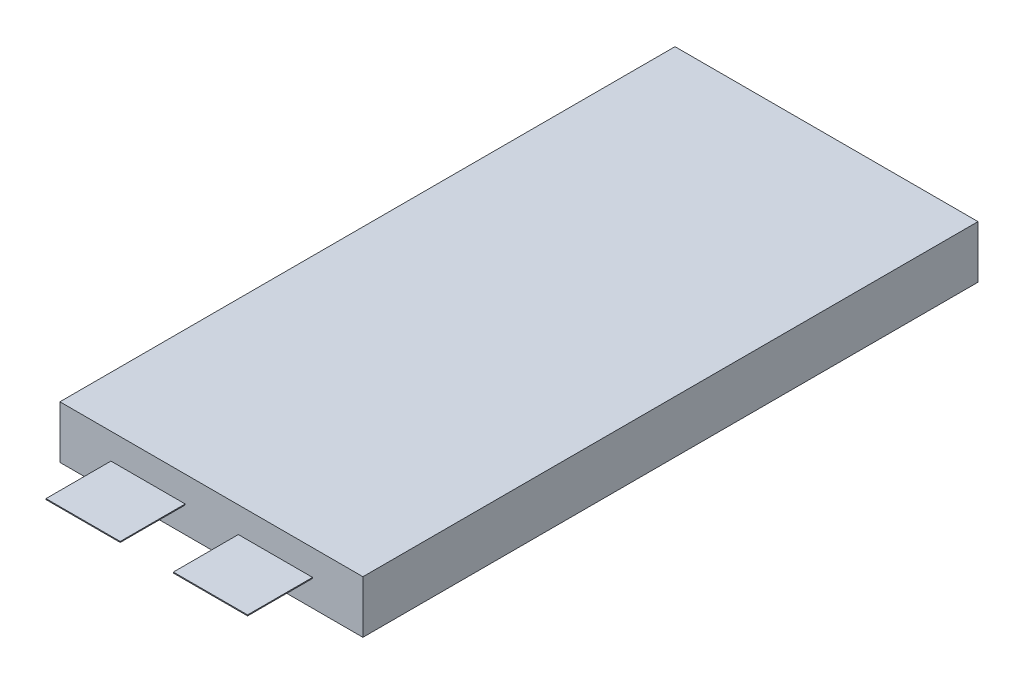
ISO-10303-21;
HEADER;
FILE_DESCRIPTION(('STEP AP214'),'2;1');
FILE_NAME('part.step','',(''),(''),'','','');
FILE_SCHEMA(('AUTOMOTIVE_DESIGN { 1 0 10303 214 1 1 1 1 }'));
ENDSEC;
DATA;
#1=APPLICATION_CONTEXT('core data for automotive mechanical design processes');
#2=APPLICATION_PROTOCOL_DEFINITION('international standard','automotive_design',2000,#1);
#3=PRODUCT_CONTEXT('',#1,'mechanical');
#4=PRODUCT('Part','Part','',(#3));
#5=PRODUCT_RELATED_PRODUCT_CATEGORY('part','',(#4));
#6=PRODUCT_DEFINITION_FORMATION('','',#4);
#7=PRODUCT_DEFINITION_CONTEXT('part definition',#1,'design');
#8=PRODUCT_DEFINITION('design','',#6,#7);
#9=PRODUCT_DEFINITION_SHAPE('','',#8);
#10=(LENGTH_UNIT() NAMED_UNIT(*) SI_UNIT(.MILLI.,.METRE.));
#11=(NAMED_UNIT(*) PLANE_ANGLE_UNIT() SI_UNIT($,.RADIAN.));
#12=(NAMED_UNIT(*) SI_UNIT($,.STERADIAN.) SOLID_ANGLE_UNIT());
#13=UNCERTAINTY_MEASURE_WITH_UNIT(LENGTH_MEASURE(1.E-05),#10,'distance_accuracy_value','');
#14=(GEOMETRIC_REPRESENTATION_CONTEXT(3) GLOBAL_UNCERTAINTY_ASSIGNED_CONTEXT((#13)) GLOBAL_UNIT_ASSIGNED_CONTEXT((#10,
#11,#12)) REPRESENTATION_CONTEXT('',''));
#15=CARTESIAN_POINT('',(0.,0.,0.));
#16=DIRECTION('',(0.,0.,1.));
#17=DIRECTION('',(1.,0.,0.));
#18=AXIS2_PLACEMENT_3D('',#15,#16,#17);
#19=CARTESIAN_POINT('',(-20.6741987179487,-3.95165064102564,66.3));
#20=DIRECTION('',(0.,1.,0.));
#21=DIRECTION('',(0.,0.,1.));
#22=AXIS2_PLACEMENT_3D('',#19,#20,#21);
#23=PLANE('',#22);
#24=CARTESIAN_POINT('',(-11.4340293879789,-3.95165064102564,62.9591826178051));
#25=DIRECTION('',(0.,-1.,0.));
#26=DIRECTION('',(0.,0.,-1.));
#27=AXIS2_PLACEMENT_3D('',#24,#25,#26);
#28=CIRCLE('',#27,3.08617774491201);
#29=CARTESIAN_POINT('',(-11.4340293879789,-3.95165064102564,59.8730048728931));
#30=VERTEX_POINT('',#29);
#31=EDGE_CURVE('E549',#30,#30,#28,.T.);
#32=ORIENTED_EDGE('',*,*,#31,.F.);
#33=EDGE_LOOP('',(#32));
#34=FACE_BOUND('',#33,.T.);
#35=DIRECTION('',(1.,0.,0.));
#36=VECTOR('',#35,1.);
#37=CARTESIAN_POINT('',(-20.6741987179487,-3.95165064102564,0.));
#38=LINE('',#37,#36);
#39=CARTESIAN_POINT('',(-20.6741987179487,-3.95165064102564,0.));
#40=VERTEX_POINT('',#39);
#41=CARTESIAN_POINT('',(11.9858012820513,-3.95165064102564,0.));
#42=VERTEX_POINT('',#41);
#43=EDGE_CURVE('E339',#40,#42,#38,.T.);
#44=ORIENTED_EDGE('',*,*,#43,.T.);
#45=DIRECTION('',(0.,0.,-1.));
#46=VECTOR('',#45,1.);
#47=CARTESIAN_POINT('',(11.9858012820513,-3.95165064102564,66.3));
#48=LINE('',#47,#46);
#49=CARTESIAN_POINT('',(11.9858012820513,-3.95165064102564,66.3));
#50=VERTEX_POINT('',#49);
#51=EDGE_CURVE('E349',#50,#42,#48,.T.);
#52=ORIENTED_EDGE('',*,*,#51,.F.);
#53=DIRECTION('',(1.,0.,0.));
#54=VECTOR('',#53,1.);
#55=CARTESIAN_POINT('',(-20.6741987179487,-3.95165064102564,66.3));
#56=LINE('',#55,#54);
#57=CARTESIAN_POINT('',(-20.6741987179487,-3.95165064102564,66.3));
#58=VERTEX_POINT('',#57);
#59=EDGE_CURVE('E329',#58,#50,#56,.T.);
#60=ORIENTED_EDGE('',*,*,#59,.F.);
#61=DIRECTION('',(0.,0.,-1.));
#62=VECTOR('',#61,1.);
#63=CARTESIAN_POINT('',(-20.6741987179487,-3.95165064102564,66.3));
#64=LINE('',#63,#62);
#65=EDGE_CURVE('E352',#58,#40,#64,.T.);
#66=ORIENTED_EDGE('',*,*,#65,.T.);
#67=EDGE_LOOP('',(#44,#52,#60,#66));
#68=FACE_BOUND('',#67,.T.);
#69=ADVANCED_FACE('F40',(#34,#68),#23,.F.);
#70=CARTESIAN_POINT('',(-20.6741987179487,1.70834935897436,66.3));
#71=DIRECTION('',(1.,0.,0.));
#72=DIRECTION('',(0.,0.,-1.));
#73=AXIS2_PLACEMENT_3D('',#70,#71,#72);
#74=PLANE('',#73);
#75=DIRECTION('',(0.,-1.,0.));
#76=VECTOR('',#75,1.);
#77=CARTESIAN_POINT('',(-20.6741987179487,1.70834935897436,0.));
#78=LINE('',#77,#76);
#79=CARTESIAN_POINT('',(-20.6741987179487,1.70834935897436,0.));
#80=VERTEX_POINT('',#79);
#81=EDGE_CURVE('E285',#80,#40,#78,.T.);
#82=ORIENTED_EDGE('',*,*,#81,.T.);
#83=ORIENTED_EDGE('',*,*,#65,.F.);
#84=DIRECTION('',(0.,-1.,0.));
#85=VECTOR('',#84,1.);
#86=CARTESIAN_POINT('',(-20.6741987179487,1.70834935897436,66.3));
#87=LINE('',#86,#85);
#88=CARTESIAN_POINT('',(-20.6741987179487,1.70834935897436,66.3));
#89=VERTEX_POINT('',#88);
#90=EDGE_CURVE('E326',#89,#58,#87,.T.);
#91=ORIENTED_EDGE('',*,*,#90,.F.);
#92=DIRECTION('',(0.,0.,-1.));
#93=VECTOR('',#92,1.);
#94=CARTESIAN_POINT('',(-20.6741987179487,1.70834935897436,66.3));
#95=LINE('',#94,#93);
#96=EDGE_CURVE('E336',#89,#80,#95,.T.);
#97=ORIENTED_EDGE('',*,*,#96,.T.);
#98=EDGE_LOOP('',(#82,#83,#91,#97));
#99=FACE_BOUND('',#98,.T.);
#100=ADVANCED_FACE('F42',(#99),#74,.F.);
#101=CARTESIAN_POINT('',(11.9858012820513,1.70834935897436,66.3));
#102=DIRECTION('',(-1.,0.,0.));
#103=DIRECTION('',(0.,0.,1.));
#104=AXIS2_PLACEMENT_3D('',#101,#102,#103);
#105=PLANE('',#104);
#106=DIRECTION('',(0.,1.,0.));
#107=VECTOR('',#106,1.);
#108=CARTESIAN_POINT('',(11.9858012820513,1.70834935897436,0.));
#109=LINE('',#108,#107);
#110=CARTESIAN_POINT('',(11.9858012820513,1.70834935897436,0.));
#111=VERTEX_POINT('',#110);
#112=EDGE_CURVE('E341',#42,#111,#109,.T.);
#113=ORIENTED_EDGE('',*,*,#112,.T.);
#114=DIRECTION('',(0.,0.,-1.));
#115=VECTOR('',#114,1.);
#116=CARTESIAN_POINT('',(11.9858012820513,1.70834935897436,66.3));
#117=LINE('',#116,#115);
#118=CARTESIAN_POINT('',(11.9858012820513,1.70834935897436,66.3));
#119=VERTEX_POINT('',#118);
#120=EDGE_CURVE('E346',#119,#111,#117,.T.);
#121=ORIENTED_EDGE('',*,*,#120,.F.);
#122=DIRECTION('',(0.,1.,0.));
#123=VECTOR('',#122,1.);
#124=CARTESIAN_POINT('',(11.9858012820513,1.70834935897436,66.3));
#125=LINE('',#124,#123);
#126=EDGE_CURVE('E332',#50,#119,#125,.T.);
#127=ORIENTED_EDGE('',*,*,#126,.F.);
#128=ORIENTED_EDGE('',*,*,#51,.T.);
#129=EDGE_LOOP('',(#113,#121,#127,#128));
#130=FACE_BOUND('',#129,.T.);
#131=ADVANCED_FACE('F402',(#130),#105,.F.);
#132=CARTESIAN_POINT('',(-20.6741987179487,1.70834935897436,66.3));
#133=DIRECTION('',(0.,-1.,0.));
#134=DIRECTION('',(0.,0.,-1.));
#135=AXIS2_PLACEMENT_3D('',#132,#133,#134);
#136=PLANE('',#135);
#137=DIRECTION('',(-1.,0.,0.));
#138=VECTOR('',#137,1.);
#139=CARTESIAN_POINT('',(-20.6741987179487,1.70834935897436,0.));
#140=LINE('',#139,#138);
#141=EDGE_CURVE('E330',#111,#80,#140,.T.);
#142=ORIENTED_EDGE('',*,*,#141,.T.);
#143=ORIENTED_EDGE('',*,*,#96,.F.);
#144=DIRECTION('',(-1.,0.,0.));
#145=VECTOR('',#144,1.);
#146=CARTESIAN_POINT('',(-20.6741987179487,1.70834935897436,66.3));
#147=LINE('',#146,#145);
#148=EDGE_CURVE('E334',#119,#89,#147,.T.);
#149=ORIENTED_EDGE('',*,*,#148,.F.);
#150=ORIENTED_EDGE('',*,*,#120,.T.);
#151=EDGE_LOOP('',(#142,#143,#149,#150));
#152=FACE_BOUND('',#151,.T.);
#153=ADVANCED_FACE('F614',(#152),#136,.F.);
#154=CARTESIAN_POINT('',(0.,0.,66.3));
#155=DIRECTION('',(0.,0.,1.));
#156=DIRECTION('',(1.,0.,0.));
#157=AXIS2_PLACEMENT_3D('',#154,#155,#156);
#158=PLANE('',#157);
#159=DIRECTION('',(0.999999970009721,0.000244909283648612,0.));
#160=VECTOR('',#159,1.);
#161=CARTESIAN_POINT('',(0.000287101408899992,-1.17227650994915,66.3));
#162=LINE('',#161,#160);
#163=CARTESIAN_POINT('',(-1.03191262784072,-1.172529305253,66.3));
#164=VERTEX_POINT('',#163);
#165=CARTESIAN_POINT('',(6.55580185641859,-1.1706710034784,66.3));
#166=VERTEX_POINT('',#165);
#167=EDGE_CURVE('E12',#164,#166,#162,.T.);
#168=ORIENTED_EDGE('',*,*,#167,.F.);
#169=DIRECTION('',(0.999999970008795,0.000244909283648386,-1.36061147739544E-06));
#170=VECTOR('',#169,1.);
#171=CARTESIAN_POINT('',(-1.44419929231587,-1.17263027808768,66.3000011333126));
#172=LINE('',#171,#170);
#173=CARTESIAN_POINT('',(-1.44419929231587,-1.17263027808768,66.3));
#174=VERTEX_POINT('',#173);
#175=EDGE_CURVE('E219',#174,#164,#172,.T.);
#176=ORIENTED_EDGE('',*,*,#175,.F.);
#177=DIRECTION('',(-1.12665993719678E-05,-0.999999999936532,0.));
#178=VECTOR('',#177,1.);
#179=CARTESIAN_POINT('',(-1.44418608057699,1.6271065989466E-05,66.3));
#180=LINE('',#179,#178);
#181=CARTESIAN_POINT('',(-1.44419916153728,-1.16102264224318,66.3));
#182=VERTEX_POINT('',#181);
#183=EDGE_CURVE('E48',#182,#174,#180,.T.);
#184=ORIENTED_EDGE('',*,*,#183,.F.);
#185=DIRECTION('',(-1.12665993691838E-05,-0.99999999968943,2.22306914609321E-05));
#186=VECTOR('',#185,1.);
#187=CARTESIAN_POINT('',(-1.44419929231587,-1.17263027808768,66.3000011333126));
#188=LINE('',#187,#186);
#189=CARTESIAN_POINT('',(-1.44419814358157,-1.07067100396361,66.3));
#190=VERTEX_POINT('',#189);
#191=EDGE_CURVE('E251',#190,#182,#188,.T.);
#192=ORIENTED_EDGE('',*,*,#191,.F.);
#193=DIRECTION('',(-0.999999969987285,-0.000244999189681806,9.08658565057508E-07));
#194=VECTOR('',#193,1.);
#195=CARTESIAN_POINT('',(-1.44419814358157,-1.07067100396361,66.2999988666874));
#196=LINE('',#195,#194);
#197=CARTESIAN_POINT('',(6.55580161631671,-1.06871101044615,66.2999915974189));
#198=VERTEX_POINT('',#197);
#199=EDGE_CURVE('E236',#198,#190,#196,.T.);
#200=ORIENTED_EDGE('',*,*,#199,.F.);
#201=DIRECTION('',(-2.35486368126074E-06,0.999999999909702,1.32306798240995E-05));
#202=VECTOR('',#201,1.);
#203=CARTESIAN_POINT('',(6.55580185641859,-1.1706710034784,66.2999902484189));
#204=LINE('',#203,#202);
#205=EDGE_CURVE('E226',#166,#198,#204,.T.);
#206=ORIENTED_EDGE('',*,*,#205,.F.);
#207=EDGE_LOOP('',(#168,#176,#184,#192,#200,#206));
#208=FACE_BOUND('',#207,.T.);
#209=DIRECTION('',(1.,0.,0.));
#210=VECTOR('',#209,1.);
#211=CARTESIAN_POINT('',(-15.1741987179487,-1.17837329170972,66.3));
#212=LINE('',#211,#210);
#213=CARTESIAN_POINT('',(-15.1741987179487,-1.17837329170972,66.3));
#214=VERTEX_POINT('',#213);
#215=CARTESIAN_POINT('',(-7.17419871794872,-1.17837329170972,66.3));
#216=VERTEX_POINT('',#215);
#217=EDGE_CURVE('E274',#214,#216,#212,.T.);
#218=ORIENTED_EDGE('',*,*,#217,.F.);
#219=DIRECTION('',(0.,-1.,0.));
#220=VECTOR('',#219,1.);
#221=CARTESIAN_POINT('',(-15.1741987179487,-1.17837329170972,66.3));
#222=LINE('',#221,#220);
#223=CARTESIAN_POINT('',(-15.1741987179487,-1.07837329170972,66.3));
#224=VERTEX_POINT('',#223);
#225=EDGE_CURVE('E307',#224,#214,#222,.T.);
#226=ORIENTED_EDGE('',*,*,#225,.F.);
#227=DIRECTION('',(-1.,0.,0.));
#228=VECTOR('',#227,1.);
#229=CARTESIAN_POINT('',(-15.1741987179487,-1.07837329170972,66.3));
#230=LINE('',#229,#228);
#231=CARTESIAN_POINT('',(-7.17419871794872,-1.07837329170972,66.3));
#232=VERTEX_POINT('',#231);
#233=EDGE_CURVE('E292',#232,#224,#230,.T.);
#234=ORIENTED_EDGE('',*,*,#233,.F.);
#235=DIRECTION('',(0.,1.,0.));
#236=VECTOR('',#235,1.);
#237=CARTESIAN_POINT('',(-7.17419871794872,-1.17837329170972,66.3));
#238=LINE('',#237,#236);
#239=EDGE_CURVE('E282',#216,#232,#238,.T.);
#240=ORIENTED_EDGE('',*,*,#239,.F.);
#241=EDGE_LOOP('',(#218,#226,#234,#240));
#242=FACE_BOUND('',#241,.T.);
#243=ORIENTED_EDGE('',*,*,#90,.T.);
#244=ORIENTED_EDGE('',*,*,#59,.T.);
#245=ORIENTED_EDGE('',*,*,#126,.T.);
#246=ORIENTED_EDGE('',*,*,#148,.T.);
#247=EDGE_LOOP('',(#243,#244,#245,#246));
#248=FACE_BOUND('',#247,.T.);
#249=ADVANCED_FACE('F375',(#208,#242,#248),#158,.T.);
#250=CARTESIAN_POINT('',(0.,0.,0.));
#251=DIRECTION('',(0.,0.,1.));
#252=DIRECTION('',(1.,0.,0.));
#253=AXIS2_PLACEMENT_3D('',#250,#251,#252);
#254=PLANE('',#253);
#255=ORIENTED_EDGE('',*,*,#81,.F.);
#256=ORIENTED_EDGE('',*,*,#141,.F.);
#257=ORIENTED_EDGE('',*,*,#112,.F.);
#258=ORIENTED_EDGE('',*,*,#43,.F.);
#259=EDGE_LOOP('',(#255,#256,#257,#258));
#260=FACE_BOUND('',#259,.T.);
#261=ADVANCED_FACE('F394',(#260),#254,.F.);
#262=CARTESIAN_POINT('',(0.,0.,73.3000000000002));
#263=DIRECTION('',(0.,0.,1.));
#264=DIRECTION('',(1.,0.,0.));
#265=AXIS2_PLACEMENT_3D('',#262,#263,#264);
#266=PLANE('',#265);
#267=DIRECTION('',(1.,0.,0.));
#268=VECTOR('',#267,1.);
#269=CARTESIAN_POINT('',(-15.1741987179487,-1.17837329170972,73.3));
#270=LINE('',#269,#268);
#271=CARTESIAN_POINT('',(-15.1741987179487,-1.17837329170972,73.3));
#272=VERTEX_POINT('',#271);
#273=CARTESIAN_POINT('',(-7.17419871794872,-1.17837329170972,73.3));
#274=VERTEX_POINT('',#273);
#275=EDGE_CURVE('E229',#272,#274,#270,.T.);
#276=ORIENTED_EDGE('',*,*,#275,.T.);
#277=DIRECTION('',(0.,1.,0.));
#278=VECTOR('',#277,1.);
#279=CARTESIAN_POINT('',(-7.17419871794872,-1.17837329170972,73.3));
#280=LINE('',#279,#278);
#281=CARTESIAN_POINT('',(-7.17419871794872,-1.07837329170972,73.3));
#282=VERTEX_POINT('',#281);
#283=EDGE_CURVE('E286',#274,#282,#280,.T.);
#284=ORIENTED_EDGE('',*,*,#283,.T.);
#285=DIRECTION('',(-1.,0.,0.));
#286=VECTOR('',#285,1.);
#287=CARTESIAN_POINT('',(-15.1741987179487,-1.07837329170972,73.3));
#288=LINE('',#287,#286);
#289=CARTESIAN_POINT('',(-15.1741987179487,-1.07837329170972,73.3));
#290=VERTEX_POINT('',#289);
#291=EDGE_CURVE('E293',#282,#290,#288,.T.);
#292=ORIENTED_EDGE('',*,*,#291,.T.);
#293=DIRECTION('',(0.,-1.,0.));
#294=VECTOR('',#293,1.);
#295=CARTESIAN_POINT('',(-15.1741987179487,-1.17837329170972,73.3));
#296=LINE('',#295,#294);
#297=EDGE_CURVE('E273',#290,#272,#296,.T.);
#298=ORIENTED_EDGE('',*,*,#297,.T.);
#299=EDGE_LOOP('',(#276,#284,#292,#298));
#300=FACE_BOUND('',#299,.T.);
#301=ADVANCED_FACE('F382',(#300),#266,.T.);
#302=CARTESIAN_POINT('',(-15.1741987179487,-1.17837329170972,66.3));
#303=DIRECTION('',(0.,-1.,0.));
#304=DIRECTION('',(0.,0.,-1.));
#305=AXIS2_PLACEMENT_3D('',#302,#303,#304);
#306=PLANE('',#305);
#307=ORIENTED_EDGE('',*,*,#275,.F.);
#308=DIRECTION('',(0.,0.,1.));
#309=VECTOR('',#308,1.);
#310=CARTESIAN_POINT('',(-15.1741987179487,-1.17837329170972,66.3));
#311=LINE('',#310,#309);
#312=EDGE_CURVE('E279',#214,#272,#311,.T.);
#313=ORIENTED_EDGE('',*,*,#312,.F.);
#314=ORIENTED_EDGE('',*,*,#217,.T.);
#315=DIRECTION('',(0.,0.,1.));
#316=VECTOR('',#315,1.);
#317=CARTESIAN_POINT('',(-7.17419871794872,-1.17837329170972,66.3));
#318=LINE('',#317,#316);
#319=EDGE_CURVE('E270',#216,#274,#318,.T.);
#320=ORIENTED_EDGE('',*,*,#319,.T.);
#321=EDGE_LOOP('',(#307,#313,#314,#320));
#322=FACE_BOUND('',#321,.T.);
#323=ADVANCED_FACE('F393',(#322),#306,.T.);
#324=CARTESIAN_POINT('',(-15.1741987179487,-1.17837329170972,66.3));
#325=DIRECTION('',(-1.,0.,0.));
#326=DIRECTION('',(0.,0.,1.));
#327=AXIS2_PLACEMENT_3D('',#324,#325,#326);
#328=PLANE('',#327);
#329=ORIENTED_EDGE('',*,*,#297,.F.);
#330=DIRECTION('',(0.,0.,1.));
#331=VECTOR('',#330,1.);
#332=CARTESIAN_POINT('',(-15.1741987179487,-1.07837329170972,66.3));
#333=LINE('',#332,#331);
#334=EDGE_CURVE('E310',#224,#290,#333,.T.);
#335=ORIENTED_EDGE('',*,*,#334,.F.);
#336=ORIENTED_EDGE('',*,*,#225,.T.);
#337=ORIENTED_EDGE('',*,*,#312,.T.);
#338=EDGE_LOOP('',(#329,#335,#336,#337));
#339=FACE_BOUND('',#338,.T.);
#340=ADVANCED_FACE('F455',(#339),#328,.T.);
#341=CARTESIAN_POINT('',(-15.1741987179487,-1.07837329170972,66.3));
#342=DIRECTION('',(0.,1.,0.));
#343=DIRECTION('',(0.,0.,1.));
#344=AXIS2_PLACEMENT_3D('',#341,#342,#343);
#345=PLANE('',#344);
#346=ORIENTED_EDGE('',*,*,#291,.F.);
#347=DIRECTION('',(0.,0.,1.));
#348=VECTOR('',#347,1.);
#349=CARTESIAN_POINT('',(-7.17419871794872,-1.07837329170972,66.3));
#350=LINE('',#349,#348);
#351=EDGE_CURVE('E289',#232,#282,#350,.T.);
#352=ORIENTED_EDGE('',*,*,#351,.F.);
#353=ORIENTED_EDGE('',*,*,#233,.T.);
#354=ORIENTED_EDGE('',*,*,#334,.T.);
#355=EDGE_LOOP('',(#346,#352,#353,#354));
#356=FACE_BOUND('',#355,.T.);
#357=ADVANCED_FACE('F449',(#356),#345,.T.);
#358=CARTESIAN_POINT('',(-7.17419871794872,-1.17837329170972,66.3));
#359=DIRECTION('',(1.,0.,0.));
#360=DIRECTION('',(0.,1.,0.));
#361=AXIS2_PLACEMENT_3D('',#358,#359,#360);
#362=PLANE('',#361);
#363=ORIENTED_EDGE('',*,*,#283,.F.);
#364=ORIENTED_EDGE('',*,*,#319,.F.);
#365=ORIENTED_EDGE('',*,*,#239,.T.);
#366=ORIENTED_EDGE('',*,*,#351,.T.);
#367=EDGE_LOOP('',(#363,#364,#365,#366));
#368=FACE_BOUND('',#367,.T.);
#369=ADVANCED_FACE('F454',(#368),#362,.T.);
#370=CARTESIAN_POINT('',(7.09908461927858E-05,0.00254361927784642,73.2999538129462));
#371=DIRECTION('',(-1.07075257308305E-06,-3.83653250068525E-05,-0.999999999263478));
#372=DIRECTION('',(0.,0.999999999264051,-3.83653250068745E-05));
#373=AXIS2_PLACEMENT_3D('',#370,#371,#372);
#374=PLANE('',#373);
#375=DIRECTION('',(-2.35486368126074E-06,0.999999999909702,1.32306798240995E-05));
#376=VECTOR('',#375,1.);
#377=CARTESIAN_POINT('',(6.55580185641859,-1.1706710034784,73.2999902484189));
#378=LINE('',#377,#376);
#379=CARTESIAN_POINT('',(6.55580185641859,-1.1706710034784,73.2999902484189));
#380=VERTEX_POINT('',#379);
#381=CARTESIAN_POINT('',(6.55580161631671,-1.06871101044615,73.2999915974189));
#382=VERTEX_POINT('',#381);
#383=EDGE_CURVE('E230',#380,#382,#378,.T.);
#384=ORIENTED_EDGE('',*,*,#383,.T.);
#385=DIRECTION('',(-0.999999969987285,-0.000244999189681806,9.08658565057508E-07));
#386=VECTOR('',#385,1.);
#387=CARTESIAN_POINT('',(-1.44419814358157,-1.07067100396361,73.2999988666874));
#388=LINE('',#387,#386);
#389=CARTESIAN_POINT('',(-1.44419814358157,-1.07067100396361,73.2999988666874));
#390=VERTEX_POINT('',#389);
#391=EDGE_CURVE('E237',#382,#390,#388,.T.);
#392=ORIENTED_EDGE('',*,*,#391,.T.);
#393=DIRECTION('',(-1.12665993691838E-05,-0.99999999968943,2.22306914609321E-05));
#394=VECTOR('',#393,1.);
#395=CARTESIAN_POINT('',(-1.44419929231587,-1.17263027808768,73.3000011333126));
#396=LINE('',#395,#394);
#397=CARTESIAN_POINT('',(-1.44419929231587,-1.17263027808768,73.3000011333126));
#398=VERTEX_POINT('',#397);
#399=EDGE_CURVE('E218',#390,#398,#396,.T.);
#400=ORIENTED_EDGE('',*,*,#399,.T.);
#401=DIRECTION('',(0.999999970008795,0.000244909283648386,-1.36061147739544E-06));
#402=VECTOR('',#401,1.);
#403=CARTESIAN_POINT('',(-1.44419929231587,-1.17263027808768,73.3000011333126));
#404=LINE('',#403,#402);
#405=EDGE_CURVE('E175',#398,#380,#404,.T.);
#406=ORIENTED_EDGE('',*,*,#405,.T.);
#407=EDGE_LOOP('',(#384,#392,#400,#406));
#408=FACE_BOUND('',#407,.T.);
#409=ADVANCED_FACE('F370',(#408),#374,.F.);
#410=CARTESIAN_POINT('',(-1.44419929231587,-1.17263027808768,66.3000011333126));
#411=DIRECTION('',(0.000244909283648612,-0.999999970009721,0.));
#412=DIRECTION('',(0.999999970009721,0.000244909283648612,0.));
#413=AXIS2_PLACEMENT_3D('',#410,#411,#412);
#414=PLANE('',#413);
#415=ORIENTED_EDGE('',*,*,#405,.F.);
#416=DIRECTION('',(0.,0.,1.));
#417=VECTOR('',#416,1.);
#418=CARTESIAN_POINT('',(-1.44419929231587,-1.17263027808768,66.3000011333126));
#419=LINE('',#418,#417);
#420=EDGE_CURVE('E223',#174,#398,#419,.T.);
#421=ORIENTED_EDGE('',*,*,#420,.F.);
#422=ORIENTED_EDGE('',*,*,#175,.T.);
#423=ORIENTED_EDGE('',*,*,#167,.T.);
#424=DIRECTION('',(0.,0.,1.));
#425=VECTOR('',#424,1.);
#426=CARTESIAN_POINT('',(6.55580185641859,-1.1706710034784,66.2999902484189));
#427=LINE('',#426,#425);
#428=EDGE_CURVE('E215',#166,#380,#427,.T.);
#429=ORIENTED_EDGE('',*,*,#428,.T.);
#430=EDGE_LOOP('',(#415,#421,#422,#423,#429));
#431=FACE_BOUND('',#430,.T.);
#432=ADVANCED_FACE('F366',(#431),#414,.T.);
#433=CARTESIAN_POINT('',(-1.44419929231587,-1.17263027808768,66.3000011333126));
#434=DIRECTION('',(-0.999999999936532,1.12665993719678E-05,0.));
#435=DIRECTION('',(-1.12665993719678E-05,-0.999999999936532,0.));
#436=AXIS2_PLACEMENT_3D('',#433,#434,#435);
#437=PLANE('',#436);
#438=ORIENTED_EDGE('',*,*,#399,.F.);
#439=DIRECTION('',(0.,0.,1.));
#440=VECTOR('',#439,1.);
#441=CARTESIAN_POINT('',(-1.44419814358157,-1.07067100396361,66.2999988666874));
#442=LINE('',#441,#440);
#443=EDGE_CURVE('E254',#190,#390,#442,.T.);
#444=ORIENTED_EDGE('',*,*,#443,.F.);
#445=ORIENTED_EDGE('',*,*,#191,.T.);
#446=ORIENTED_EDGE('',*,*,#183,.T.);
#447=ORIENTED_EDGE('',*,*,#420,.T.);
#448=EDGE_LOOP('',(#438,#444,#445,#446,#447));
#449=FACE_BOUND('',#448,.T.);
#450=ADVANCED_FACE('F362',(#449),#437,.T.);
#451=CARTESIAN_POINT('',(-1.44419814358157,-1.07067100396361,66.2999988666874));
#452=DIRECTION('',(-0.000244999189681907,0.999999969987698,0.));
#453=DIRECTION('',(-0.999999969987698,-0.000244999189681907,0.));
#454=AXIS2_PLACEMENT_3D('',#451,#452,#453);
#455=PLANE('',#454);
#456=ORIENTED_EDGE('',*,*,#391,.F.);
#457=DIRECTION('',(0.,0.,1.));
#458=VECTOR('',#457,1.);
#459=CARTESIAN_POINT('',(6.55580161631671,-1.06871101044615,66.2999915974189));
#460=LINE('',#459,#458);
#461=EDGE_CURVE('E233',#198,#382,#460,.T.);
#462=ORIENTED_EDGE('',*,*,#461,.F.);
#463=ORIENTED_EDGE('',*,*,#199,.T.);
#464=ORIENTED_EDGE('',*,*,#443,.T.);
#465=EDGE_LOOP('',(#456,#462,#463,#464));
#466=FACE_BOUND('',#465,.T.);
#467=ADVANCED_FACE('F374',(#466),#455,.T.);
#468=CARTESIAN_POINT('',(6.55580185641859,-1.1706710034784,66.2999902484189));
#469=DIRECTION('',(0.999999999997227,2.35486368146685E-06,0.));
#470=DIRECTION('',(-2.35486368146685E-06,0.999999999997227,0.));
#471=AXIS2_PLACEMENT_3D('',#468,#469,#470);
#472=PLANE('',#471);
#473=ORIENTED_EDGE('',*,*,#383,.F.);
#474=ORIENTED_EDGE('',*,*,#428,.F.);
#475=ORIENTED_EDGE('',*,*,#205,.T.);
#476=ORIENTED_EDGE('',*,*,#461,.T.);
#477=EDGE_LOOP('',(#473,#474,#475,#476));
#478=FACE_BOUND('',#477,.T.);
#479=ADVANCED_FACE('F378',(#478),#472,.T.);
#480=CARTESIAN_POINT('',(0.,-3.85165064102565,0.));
#481=DIRECTION('',(0.,1.,0.));
#482=DIRECTION('',(0.,0.,1.));
#483=AXIS2_PLACEMENT_3D('',#480,#481,#482);
#484=PLANE('',#483);
#485=CARTESIAN_POINT('',(-11.4340293879789,-3.85165064102564,62.9591826178051));
#486=DIRECTION('',(0.,-1.,0.));
#487=DIRECTION('',(0.,0.,-1.));
#488=AXIS2_PLACEMENT_3D('',#485,#486,#487);
#489=CIRCLE('',#488,3.08617774491201);
#490=CARTESIAN_POINT('',(-11.4340293879789,-3.85165064102564,59.8730048728931));
#491=VERTEX_POINT('',#490);
#492=EDGE_CURVE('E192',#491,#491,#489,.T.);
#493=ORIENTED_EDGE('',*,*,#492,.T.);
#494=EDGE_LOOP('',(#493));
#495=FACE_BOUND('',#494,.T.);
#496=CARTESIAN_POINT('',(-11.4340293879789,-3.85165064102564,62.9591826178051));
#497=DIRECTION('',(0.,-1.,0.));
#498=DIRECTION('',(0.,0.,-1.));
#499=AXIS2_PLACEMENT_3D('',#496,#497,#498);
#500=CIRCLE('',#499,2.93244215807221);
#501=CARTESIAN_POINT('',(-11.4340293879789,-3.85165064102564,60.0267404597329));
#502=VERTEX_POINT('',#501);
#503=EDGE_CURVE('E547',#502,#502,#500,.T.);
#504=ORIENTED_EDGE('',*,*,#503,.F.);
#505=EDGE_LOOP('',(#504));
#506=FACE_BOUND('',#505,.T.);
#507=ADVANCED_FACE('F380',(#495,#506),#484,.F.);
#508=CARTESIAN_POINT('',(-11.4340293879789,-3.95165064102564,62.9591826178051));
#509=DIRECTION('',(0.,1.,0.));
#510=DIRECTION('',(0.,0.,1.));
#511=AXIS2_PLACEMENT_3D('',#508,#509,#510);
#512=CYLINDRICAL_SURFACE('',#511,3.08617774491201);
#513=ORIENTED_EDGE('',*,*,#31,.T.);
#514=EDGE_LOOP('',(#513));
#515=FACE_BOUND('',#514,.T.);
#516=ORIENTED_EDGE('',*,*,#492,.F.);
#517=EDGE_LOOP('',(#516));
#518=FACE_BOUND('',#517,.T.);
#519=ADVANCED_FACE('F387',(#515,#518),#512,.F.);
#520=CARTESIAN_POINT('',(-11.4340293879789,-3.95165064102564,62.9591826178051));
#521=DIRECTION('',(0.,1.,0.));
#522=DIRECTION('',(0.,0.,1.));
#523=AXIS2_PLACEMENT_3D('',#520,#521,#522);
#524=CYLINDRICAL_SURFACE('',#523,2.93244215807221);
#525=CARTESIAN_POINT('',(-11.4340293879789,-3.95165064102564,62.9591826178051));
#526=DIRECTION('',(0.,-1.,0.));
#527=DIRECTION('',(0.,0.,-1.));
#528=AXIS2_PLACEMENT_3D('',#525,#526,#527);
#529=CIRCLE('',#528,2.93244215807221);
#530=CARTESIAN_POINT('',(-11.4340293879789,-3.95165064102564,60.0267404597329));
#531=VERTEX_POINT('',#530);
#532=EDGE_CURVE('E544',#531,#531,#529,.T.);
#533=ORIENTED_EDGE('',*,*,#532,.F.);
#534=EDGE_LOOP('',(#533));
#535=FACE_BOUND('',#534,.T.);
#536=ORIENTED_EDGE('',*,*,#503,.T.);
#537=EDGE_LOOP('',(#536));
#538=FACE_BOUND('',#537,.T.);
#539=ADVANCED_FACE('F429',(#535,#538),#524,.T.);
#540=CARTESIAN_POINT('',(0.,-3.85165064102565,0.));
#541=DIRECTION('',(0.,-1.,0.));
#542=DIRECTION('',(0.,0.,-1.));
#543=AXIS2_PLACEMENT_3D('',#540,#541,#542);
#544=PLANE('',#543);
#545=DIRECTION('',(1.,0.,0.));
#546=VECTOR('',#545,1.);
#547=CARTESIAN_POINT('',(-14.0004009557349,-3.85165064102564,62.7689139794001));
#548=LINE('',#547,#546);
#549=CARTESIAN_POINT('',(-14.0004009557349,-3.85165064102564,62.7689139794001));
#550=VERTEX_POINT('',#549);
#551=CARTESIAN_POINT('',(-8.86765782022288,-3.85165064102564,62.7689139794001));
#552=VERTEX_POINT('',#551);
#553=EDGE_CURVE('E189',#550,#552,#548,.T.);
#554=ORIENTED_EDGE('',*,*,#553,.T.);
#555=DIRECTION('',(0.,0.,1.));
#556=VECTOR('',#555,1.);
#557=CARTESIAN_POINT('',(-8.86765782022288,-3.85165064102564,62.7689139794001));
#558=LINE('',#557,#556);
#559=CARTESIAN_POINT('',(-8.86765782022288,-3.85165064102564,63.14945125621));
#560=VERTEX_POINT('',#559);
#561=EDGE_CURVE('E176',#552,#560,#558,.T.);
#562=ORIENTED_EDGE('',*,*,#561,.T.);
#563=DIRECTION('',(-1.,0.,0.));
#564=VECTOR('',#563,1.);
#565=CARTESIAN_POINT('',(-14.0004009557349,-3.85165064102564,63.14945125621));
#566=LINE('',#565,#564);
#567=CARTESIAN_POINT('',(-14.0004009557349,-3.85165064102564,63.14945125621));
#568=VERTEX_POINT('',#567);
#569=EDGE_CURVE('E166',#560,#568,#566,.T.);
#570=ORIENTED_EDGE('',*,*,#569,.T.);
#571=DIRECTION('',(0.,0.,-1.));
#572=VECTOR('',#571,1.);
#573=CARTESIAN_POINT('',(-14.0004009557349,-3.85165064102564,62.7689139794001));
#574=LINE('',#573,#572);
#575=EDGE_CURVE('E202',#568,#550,#574,.T.);
#576=ORIENTED_EDGE('',*,*,#575,.T.);
#577=EDGE_LOOP('',(#554,#562,#570,#576));
#578=FACE_BOUND('',#577,.T.);
#579=ADVANCED_FACE('F426',(#578),#544,.T.);
#580=CARTESIAN_POINT('',(-8.86765782022288,-3.95165064102564,62.7689139794001));
#581=DIRECTION('',(-1.,0.,0.));
#582=DIRECTION('',(0.,0.,1.));
#583=AXIS2_PLACEMENT_3D('',#580,#581,#582);
#584=PLANE('',#583);
#585=ORIENTED_EDGE('',*,*,#561,.F.);
#586=DIRECTION('',(0.,1.,0.));
#587=VECTOR('',#586,1.);
#588=CARTESIAN_POINT('',(-8.86765782022288,-3.95165064102564,62.7689139794001));
#589=LINE('',#588,#587);
#590=CARTESIAN_POINT('',(-8.86765782022288,-3.95165064102564,62.7689139794001));
#591=VERTEX_POINT('',#590);
#592=EDGE_CURVE('E173',#591,#552,#589,.T.);
#593=ORIENTED_EDGE('',*,*,#592,.F.);
#594=DIRECTION('',(0.,0.,1.));
#595=VECTOR('',#594,1.);
#596=CARTESIAN_POINT('',(-8.86765782022288,-3.95165064102564,62.7689139794001));
#597=LINE('',#596,#595);
#598=CARTESIAN_POINT('',(-8.86765782022288,-3.95165064102564,63.14945125621));
#599=VERTEX_POINT('',#598);
#600=EDGE_CURVE('E171',#591,#599,#597,.T.);
#601=ORIENTED_EDGE('',*,*,#600,.T.);
#602=DIRECTION('',(0.,1.,0.));
#603=VECTOR('',#602,1.);
#604=CARTESIAN_POINT('',(-8.86765782022288,-3.95165064102564,63.14945125621));
#605=LINE('',#604,#603);
#606=EDGE_CURVE('E159',#599,#560,#605,.T.);
#607=ORIENTED_EDGE('',*,*,#606,.T.);
#608=EDGE_LOOP('',(#585,#593,#601,#607));
#609=FACE_BOUND('',#608,.T.);
#610=ADVANCED_FACE('F172',(#609),#584,.T.);
#611=CARTESIAN_POINT('',(-14.0004009557349,-3.95165064102564,63.14945125621));
#612=DIRECTION('',(0.,0.,-1.));
#613=DIRECTION('',(-1.,0.,0.));
#614=AXIS2_PLACEMENT_3D('',#611,#612,#613);
#615=PLANE('',#614);
#616=ORIENTED_EDGE('',*,*,#569,.F.);
#617=ORIENTED_EDGE('',*,*,#606,.F.);
#618=DIRECTION('',(-1.,0.,0.));
#619=VECTOR('',#618,1.);
#620=CARTESIAN_POINT('',(-14.0004009557349,-3.95165064102564,63.14945125621));
#621=LINE('',#620,#619);
#622=CARTESIAN_POINT('',(-14.0004009557349,-3.95165064102564,63.14945125621));
#623=VERTEX_POINT('',#622);
#624=EDGE_CURVE('E164',#599,#623,#621,.T.);
#625=ORIENTED_EDGE('',*,*,#624,.T.);
#626=DIRECTION('',(0.,1.,0.));
#627=VECTOR('',#626,1.);
#628=CARTESIAN_POINT('',(-14.0004009557349,-3.95165064102564,63.14945125621));
#629=LINE('',#628,#627);
#630=EDGE_CURVE('E200',#623,#568,#629,.T.);
#631=ORIENTED_EDGE('',*,*,#630,.T.);
#632=EDGE_LOOP('',(#616,#617,#625,#631));
#633=FACE_BOUND('',#632,.T.);
#634=ADVANCED_FACE('F161',(#633),#615,.T.);
#635=CARTESIAN_POINT('',(-14.0004009557349,-3.95165064102564,62.7689139794001));
#636=DIRECTION('',(1.,0.,0.));
#637=DIRECTION('',(0.,0.,-1.));
#638=AXIS2_PLACEMENT_3D('',#635,#636,#637);
#639=PLANE('',#638);
#640=ORIENTED_EDGE('',*,*,#575,.F.);
#641=ORIENTED_EDGE('',*,*,#630,.F.);
#642=DIRECTION('',(0.,0.,-1.));
#643=VECTOR('',#642,1.);
#644=CARTESIAN_POINT('',(-14.0004009557349,-3.95165064102564,62.7689139794001));
#645=LINE('',#644,#643);
#646=CARTESIAN_POINT('',(-14.0004009557349,-3.95165064102564,62.7689139794001));
#647=VERTEX_POINT('',#646);
#648=EDGE_CURVE('E181',#623,#647,#645,.T.);
#649=ORIENTED_EDGE('',*,*,#648,.T.);
#650=DIRECTION('',(0.,1.,0.));
#651=VECTOR('',#650,1.);
#652=CARTESIAN_POINT('',(-14.0004009557349,-3.95165064102564,62.7689139794001));
#653=LINE('',#652,#651);
#654=EDGE_CURVE('E191',#647,#550,#653,.T.);
#655=ORIENTED_EDGE('',*,*,#654,.T.);
#656=EDGE_LOOP('',(#640,#641,#649,#655));
#657=FACE_BOUND('',#656,.T.);
#658=ADVANCED_FACE('F412',(#657),#639,.T.);
#659=CARTESIAN_POINT('',(-14.0004009557349,-3.95165064102564,62.7689139794001));
#660=DIRECTION('',(0.,0.,1.));
#661=DIRECTION('',(1.,0.,0.));
#662=AXIS2_PLACEMENT_3D('',#659,#660,#661);
#663=PLANE('',#662);
#664=ORIENTED_EDGE('',*,*,#553,.F.);
#665=ORIENTED_EDGE('',*,*,#654,.F.);
#666=DIRECTION('',(1.,0.,0.));
#667=VECTOR('',#666,1.);
#668=CARTESIAN_POINT('',(-14.0004009557349,-3.95165064102564,62.7689139794001));
#669=LINE('',#668,#667);
#670=EDGE_CURVE('E55',#647,#591,#669,.T.);
#671=ORIENTED_EDGE('',*,*,#670,.T.);
#672=ORIENTED_EDGE('',*,*,#592,.T.);
#673=EDGE_LOOP('',(#664,#665,#671,#672));
#674=FACE_BOUND('',#673,.T.);
#675=ADVANCED_FACE('F408',(#674),#663,.T.);
#676=ORIENTED_EDGE('',*,*,#670,.F.);
#677=ORIENTED_EDGE('',*,*,#648,.F.);
#678=ORIENTED_EDGE('',*,*,#624,.F.);
#679=ORIENTED_EDGE('',*,*,#600,.F.);
#680=EDGE_LOOP('',(#676,#677,#678,#679));
#681=FACE_BOUND('',#680,.T.);
#682=ORIENTED_EDGE('',*,*,#532,.T.);
#683=EDGE_LOOP('',(#682));
#684=FACE_BOUND('',#683,.T.);
#685=ADVANCED_FACE('F178',(#681,#684),#23,.F.);
#686=CLOSED_SHELL('',(#69,#100,#131,#153,#249,#261,#301,#323,#340,#357,#369,#409,#432,#450,#467,
#479,#507,#519,#539,#579,#610,#634,#658,#675,#685));
#687=MANIFOLD_SOLID_BREP('B2',#686);
#688=ADVANCED_BREP_SHAPE_REPRESENTATION('',(#18,#687),#14);
#689=SHAPE_DEFINITION_REPRESENTATION(#9,#688);
ENDSEC;
END-ISO-10303-21;
